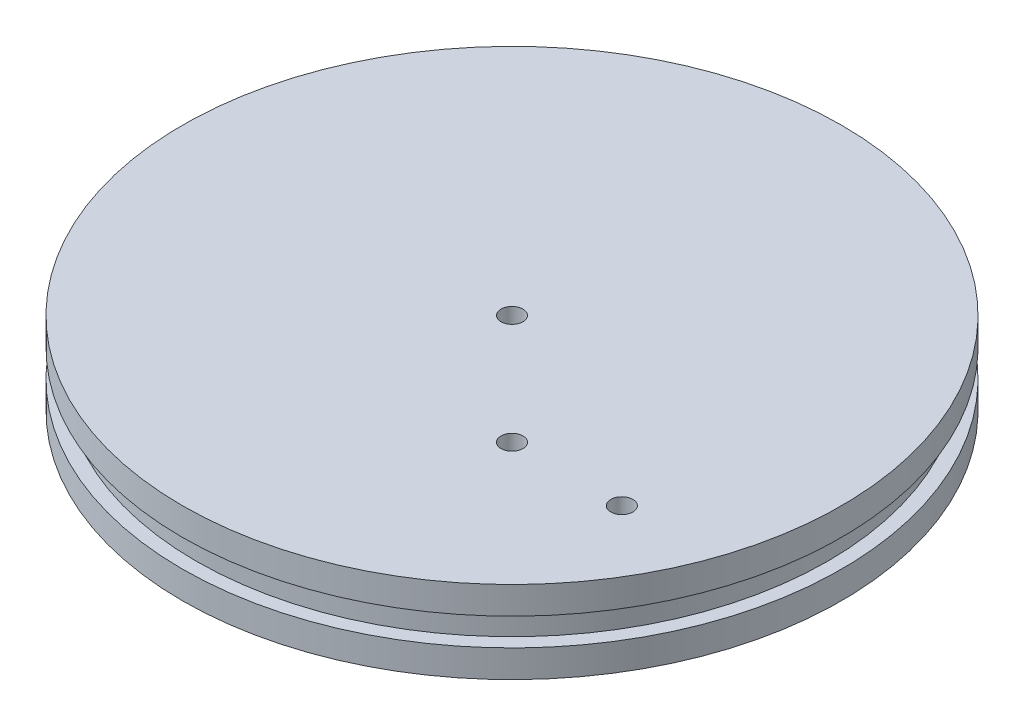
ISO-10303-21;
HEADER;
FILE_DESCRIPTION(('STEP AP214'),'2;1');
FILE_NAME('part.step','',(''),(''),'','','');
FILE_SCHEMA(('AUTOMOTIVE_DESIGN { 1 0 10303 214 1 1 1 1 }'));
ENDSEC;
DATA;
#1=APPLICATION_CONTEXT('core data for automotive mechanical design processes');
#2=APPLICATION_PROTOCOL_DEFINITION('international standard','automotive_design',2000,#1);
#3=PRODUCT_CONTEXT('',#1,'mechanical');
#4=PRODUCT('Part','Part','',(#3));
#5=PRODUCT_RELATED_PRODUCT_CATEGORY('part','',(#4));
#6=PRODUCT_DEFINITION_FORMATION('','',#4);
#7=PRODUCT_DEFINITION_CONTEXT('part definition',#1,'design');
#8=PRODUCT_DEFINITION('design','',#6,#7);
#9=PRODUCT_DEFINITION_SHAPE('','',#8);
#10=(LENGTH_UNIT() NAMED_UNIT(*) SI_UNIT(.MILLI.,.METRE.));
#11=(NAMED_UNIT(*) PLANE_ANGLE_UNIT() SI_UNIT($,.RADIAN.));
#12=(NAMED_UNIT(*) SI_UNIT($,.STERADIAN.) SOLID_ANGLE_UNIT());
#13=UNCERTAINTY_MEASURE_WITH_UNIT(LENGTH_MEASURE(1.E-05),#10,'distance_accuracy_value','');
#14=(GEOMETRIC_REPRESENTATION_CONTEXT(3) GLOBAL_UNCERTAINTY_ASSIGNED_CONTEXT((#13)) GLOBAL_UNIT_ASSIGNED_CONTEXT((#10,
#11,#12)) REPRESENTATION_CONTEXT('',''));
#15=CARTESIAN_POINT('',(0.,0.,0.));
#16=DIRECTION('',(0.,0.,1.));
#17=DIRECTION('',(1.,0.,0.));
#18=AXIS2_PLACEMENT_3D('',#15,#16,#17);
#19=CARTESIAN_POINT('',(0.,19.05,0.));
#20=DIRECTION('',(0.,-1.,0.));
#21=DIRECTION('',(0.,0.,-1.));
#22=AXIS2_PLACEMENT_3D('',#19,#20,#21);
#23=CYLINDRICAL_SURFACE('',#22,76.2);
#24=CARTESIAN_POINT('',(0.,0.,0.));
#25=DIRECTION('',(0.,1.,0.));
#26=DIRECTION('',(0.,0.,1.));
#27=AXIS2_PLACEMENT_3D('',#24,#25,#26);
#28=CIRCLE('',#27,76.2);
#29=CARTESIAN_POINT('',(0.,0.,-76.2));
#30=VERTEX_POINT('',#29);
#31=EDGE_CURVE('E35',#30,#30,#28,.T.);
#32=CARTESIAN_POINT('',(0.,6.35,0.));
#33=DIRECTION('',(0.,-1.,0.));
#34=DIRECTION('',(0.,0.,-1.));
#35=AXIS2_PLACEMENT_3D('',#32,#33,#34);
#36=CIRCLE('',#35,76.2);
#37=CARTESIAN_POINT('',(0.,6.35,-76.2));
#38=VERTEX_POINT('',#37);
#39=EDGE_CURVE('E59',#38,#38,#36,.T.);
#40=CARTESIAN_POINT('',(0.,0.,-76.2));
#41=CARTESIAN_POINT('',(0.,0.0661458333333329,-76.2));
#42=CARTESIAN_POINT('',(0.,0.132291666666666,-76.2));
#43=CARTESIAN_POINT('',(0.,0.264583333333333,-76.2));
#44=CARTESIAN_POINT('',(0.,0.330729166666667,-76.2));
#45=CARTESIAN_POINT('',(0.,0.463020833333334,-76.2));
#46=CARTESIAN_POINT('',(0.,0.529166666666667,-76.2));
#47=CARTESIAN_POINT('',(0.,0.661458333333333,-76.2));
#48=CARTESIAN_POINT('',(0.,0.727604166666666,-76.2));
#49=CARTESIAN_POINT('',(0.,0.859895833333334,-76.2));
#50=CARTESIAN_POINT('',(0.,0.926041666666668,-76.2));
#51=CARTESIAN_POINT('',(0.,1.05833333333333,-76.2));
#52=CARTESIAN_POINT('',(0.,1.12447916666667,-76.2));
#53=CARTESIAN_POINT('',(0.,1.25677083333333,-76.2));
#54=CARTESIAN_POINT('',(0.,1.32291666666667,-76.2));
#55=CARTESIAN_POINT('',(0.,1.45520833333333,-76.2));
#56=CARTESIAN_POINT('',(0.,1.52135416666667,-76.2));
#57=CARTESIAN_POINT('',(0.,1.65364583333333,-76.2));
#58=CARTESIAN_POINT('',(0.,1.71979166666667,-76.2));
#59=CARTESIAN_POINT('',(0.,1.85208333333333,-76.2));
#60=CARTESIAN_POINT('',(0.,1.91822916666667,-76.2));
#61=CARTESIAN_POINT('',(0.,2.05052083333333,-76.2));
#62=CARTESIAN_POINT('',(0.,2.11666666666667,-76.2));
#63=CARTESIAN_POINT('',(0.,2.24895833333333,-76.2));
#64=CARTESIAN_POINT('',(0.,2.31510416666667,-76.2));
#65=CARTESIAN_POINT('',(0.,2.44739583333333,-76.2));
#66=CARTESIAN_POINT('',(0.,2.51354166666667,-76.2));
#67=CARTESIAN_POINT('',(0.,2.64583333333333,-76.2));
#68=CARTESIAN_POINT('',(0.,2.71197916666667,-76.2));
#69=CARTESIAN_POINT('',(0.,2.84427083333333,-76.2));
#70=CARTESIAN_POINT('',(0.,2.91041666666667,-76.2));
#71=CARTESIAN_POINT('',(0.,3.04270833333333,-76.2));
#72=CARTESIAN_POINT('',(0.,3.10885416666667,-76.2));
#73=CARTESIAN_POINT('',(0.,3.24114583333333,-76.2));
#74=CARTESIAN_POINT('',(0.,3.30729166666667,-76.2));
#75=CARTESIAN_POINT('',(0.,3.43958333333333,-76.2));
#76=CARTESIAN_POINT('',(0.,3.50572916666667,-76.2));
#77=CARTESIAN_POINT('',(0.,3.63802083333333,-76.2));
#78=CARTESIAN_POINT('',(0.,3.70416666666667,-76.2));
#79=CARTESIAN_POINT('',(0.,3.83645833333333,-76.2));
#80=CARTESIAN_POINT('',(0.,3.90260416666667,-76.2));
#81=CARTESIAN_POINT('',(0.,4.03489583333333,-76.2));
#82=CARTESIAN_POINT('',(0.,4.10104166666667,-76.2));
#83=CARTESIAN_POINT('',(0.,4.23333333333333,-76.2));
#84=CARTESIAN_POINT('',(0.,4.29947916666667,-76.2));
#85=CARTESIAN_POINT('',(0.,4.43177083333333,-76.2));
#86=CARTESIAN_POINT('',(0.,4.49791666666667,-76.2));
#87=CARTESIAN_POINT('',(0.,4.63020833333333,-76.2));
#88=CARTESIAN_POINT('',(0.,4.69635416666667,-76.2));
#89=CARTESIAN_POINT('',(0.,4.82864583333333,-76.2));
#90=CARTESIAN_POINT('',(0.,4.89479166666667,-76.2));
#91=CARTESIAN_POINT('',(0.,5.02708333333333,-76.2));
#92=CARTESIAN_POINT('',(0.,5.09322916666667,-76.2));
#93=CARTESIAN_POINT('',(0.,5.22552083333333,-76.2));
#94=CARTESIAN_POINT('',(0.,5.29166666666667,-76.2));
#95=CARTESIAN_POINT('',(0.,5.42395833333333,-76.2));
#96=CARTESIAN_POINT('',(0.,5.49010416666667,-76.2));
#97=CARTESIAN_POINT('',(0.,5.62239583333333,-76.2));
#98=CARTESIAN_POINT('',(0.,5.68854166666667,-76.2));
#99=CARTESIAN_POINT('',(0.,5.82083333333333,-76.2));
#100=CARTESIAN_POINT('',(0.,5.88697916666667,-76.2));
#101=CARTESIAN_POINT('',(0.,6.01927083333333,-76.2));
#102=CARTESIAN_POINT('',(0.,6.08541666666667,-76.2));
#103=CARTESIAN_POINT('',(0.,6.21770833333333,-76.2));
#104=CARTESIAN_POINT('',(0.,6.28385416666667,-76.2));
#105=CARTESIAN_POINT('',(0.,6.35,-76.2));
#106=B_SPLINE_CURVE_WITH_KNOTS('',3,(#40,#41,#42,#43,#44,#45,#46,#47,#48,#49,#50,#51,#52,#53,
#54,#55,#56,#57,#58,#59,#60,#61,#62,#63,#64,#65,#66,#67,#68,#69,#70,#71,#72,#73,#74,#75,#76,#77,
#78,#79,#80,#81,#82,#83,#84,#85,#86,#87,#88,#89,#90,#91,#92,#93,#94,#95,#96,#97,#98,#99,#100,
#101,#102,#103,#104,#105),.UNSPECIFIED.,.F.,.F.,(4,2,2,2,2,2,2,2,2,2,2,2,2,2,2,2,2,2,2,2,2,2,2,
2,2,2,2,2,2,2,2,2,4),(0.,0.198437499999999,0.396875000000001,0.5953125,0.793749999999999,
0.992187500000002,1.190625,1.3890625,1.5875,1.7859375,1.984375,2.1828125,2.38125,2.5796875,
2.778125,2.9765625,3.175,3.3734375,3.571875,3.7703125,3.96875,4.1671875,4.365625,4.5640625,
4.7625,4.9609375,5.159375,5.3578125,5.55625,5.7546875,5.953125,6.1515625,6.35),.UNSPECIFIED.);
#107=EDGE_CURVE('BSEAM32',#30,#38,#106,.T.);
#108=ORIENTED_EDGE('',*,*,#31,.T.);
#109=ORIENTED_EDGE('',*,*,#39,.T.);
#110=ORIENTED_EDGE('',*,*,#107,.T.);
#111=ORIENTED_EDGE('',*,*,#107,.F.);
#112=EDGE_LOOP('',(#108,#110,#109,#111));
#113=FACE_BOUND('',#112,.T.);
#114=ADVANCED_FACE('F32',(#113),#23,.T.);
#115=CARTESIAN_POINT('',(0.,19.05,0.));
#116=DIRECTION('',(0.,1.,0.));
#117=DIRECTION('',(0.,0.,1.));
#118=AXIS2_PLACEMENT_3D('',#115,#116,#117);
#119=CIRCLE('',#118,76.2);
#120=CARTESIAN_POINT('',(0.,19.05,-76.2));
#121=VERTEX_POINT('',#120);
#122=EDGE_CURVE('E10',#121,#121,#119,.T.);
#123=CARTESIAN_POINT('',(0.,12.7,0.));
#124=DIRECTION('',(0.,-1.,0.));
#125=DIRECTION('',(0.,0.,-1.));
#126=AXIS2_PLACEMENT_3D('',#123,#124,#125);
#127=CIRCLE('',#126,76.2);
#128=CARTESIAN_POINT('',(0.,12.7,-76.2));
#129=VERTEX_POINT('',#128);
#130=EDGE_CURVE('E70',#129,#129,#127,.T.);
#131=CARTESIAN_POINT('',(0.,19.05,-76.2));
#132=CARTESIAN_POINT('',(0.,18.9838541666667,-76.2));
#133=CARTESIAN_POINT('',(0.,18.9177083333333,-76.2));
#134=CARTESIAN_POINT('',(0.,18.7854166666667,-76.2));
#135=CARTESIAN_POINT('',(0.,18.7192708333333,-76.2));
#136=CARTESIAN_POINT('',(0.,18.5869791666667,-76.2));
#137=CARTESIAN_POINT('',(0.,18.5208333333333,-76.2));
#138=CARTESIAN_POINT('',(0.,18.3885416666667,-76.2));
#139=CARTESIAN_POINT('',(0.,18.3223958333333,-76.2));
#140=CARTESIAN_POINT('',(0.,18.1901041666667,-76.2));
#141=CARTESIAN_POINT('',(0.,18.1239583333333,-76.2));
#142=CARTESIAN_POINT('',(0.,17.9916666666667,-76.2));
#143=CARTESIAN_POINT('',(0.,17.9255208333333,-76.2));
#144=CARTESIAN_POINT('',(0.,17.7932291666667,-76.2));
#145=CARTESIAN_POINT('',(0.,17.7270833333333,-76.2));
#146=CARTESIAN_POINT('',(0.,17.5947916666667,-76.2));
#147=CARTESIAN_POINT('',(0.,17.5286458333333,-76.2));
#148=CARTESIAN_POINT('',(0.,17.3963541666667,-76.2));
#149=CARTESIAN_POINT('',(0.,17.3302083333333,-76.2));
#150=CARTESIAN_POINT('',(0.,17.1979166666667,-76.2));
#151=CARTESIAN_POINT('',(0.,17.1317708333333,-76.2));
#152=CARTESIAN_POINT('',(0.,16.9994791666667,-76.2));
#153=CARTESIAN_POINT('',(0.,16.9333333333333,-76.2));
#154=CARTESIAN_POINT('',(0.,16.8010416666667,-76.2));
#155=CARTESIAN_POINT('',(0.,16.7348958333333,-76.2));
#156=CARTESIAN_POINT('',(0.,16.6026041666667,-76.2));
#157=CARTESIAN_POINT('',(0.,16.5364583333333,-76.2));
#158=CARTESIAN_POINT('',(0.,16.4041666666667,-76.2));
#159=CARTESIAN_POINT('',(0.,16.3380208333333,-76.2));
#160=CARTESIAN_POINT('',(0.,16.2057291666667,-76.2));
#161=CARTESIAN_POINT('',(0.,16.1395833333333,-76.2));
#162=CARTESIAN_POINT('',(0.,16.0072916666667,-76.2));
#163=CARTESIAN_POINT('',(0.,15.9411458333333,-76.2));
#164=CARTESIAN_POINT('',(0.,15.8088541666667,-76.2));
#165=CARTESIAN_POINT('',(0.,15.7427083333333,-76.2));
#166=CARTESIAN_POINT('',(0.,15.6104166666667,-76.2));
#167=CARTESIAN_POINT('',(0.,15.5442708333333,-76.2));
#168=CARTESIAN_POINT('',(0.,15.4119791666667,-76.2));
#169=CARTESIAN_POINT('',(0.,15.3458333333333,-76.2));
#170=CARTESIAN_POINT('',(0.,15.2135416666667,-76.2));
#171=CARTESIAN_POINT('',(0.,15.1473958333333,-76.2));
#172=CARTESIAN_POINT('',(0.,15.0151041666667,-76.2));
#173=CARTESIAN_POINT('',(0.,14.9489583333333,-76.2));
#174=CARTESIAN_POINT('',(0.,14.8166666666667,-76.2));
#175=CARTESIAN_POINT('',(0.,14.7505208333333,-76.2));
#176=CARTESIAN_POINT('',(0.,14.6182291666667,-76.2));
#177=CARTESIAN_POINT('',(0.,14.5520833333333,-76.2));
#178=CARTESIAN_POINT('',(0.,14.4197916666667,-76.2));
#179=CARTESIAN_POINT('',(0.,14.3536458333333,-76.2));
#180=CARTESIAN_POINT('',(0.,14.2213541666667,-76.2));
#181=CARTESIAN_POINT('',(0.,14.1552083333333,-76.2));
#182=CARTESIAN_POINT('',(0.,14.0229166666667,-76.2));
#183=CARTESIAN_POINT('',(0.,13.9567708333333,-76.2));
#184=CARTESIAN_POINT('',(0.,13.8244791666667,-76.2));
#185=CARTESIAN_POINT('',(0.,13.7583333333333,-76.2));
#186=CARTESIAN_POINT('',(0.,13.6260416666667,-76.2));
#187=CARTESIAN_POINT('',(0.,13.5598958333333,-76.2));
#188=CARTESIAN_POINT('',(0.,13.4276041666667,-76.2));
#189=CARTESIAN_POINT('',(0.,13.3614583333333,-76.2));
#190=CARTESIAN_POINT('',(0.,13.2291666666667,-76.2));
#191=CARTESIAN_POINT('',(0.,13.1630208333333,-76.2));
#192=CARTESIAN_POINT('',(0.,13.0307291666667,-76.2));
#193=CARTESIAN_POINT('',(0.,12.9645833333333,-76.2));
#194=CARTESIAN_POINT('',(0.,12.8322916666667,-76.2));
#195=CARTESIAN_POINT('',(0.,12.7661458333333,-76.2));
#196=CARTESIAN_POINT('',(0.,12.7,-76.2));
#197=B_SPLINE_CURVE_WITH_KNOTS('',3,(#131,#132,#133,#134,#135,#136,#137,#138,#139,#140,#141,
#142,#143,#144,#145,#146,#147,#148,#149,#150,#151,#152,#153,#154,#155,#156,#157,#158,#159,#160,
#161,#162,#163,#164,#165,#166,#167,#168,#169,#170,#171,#172,#173,#174,#175,#176,#177,#178,#179,
#180,#181,#182,#183,#184,#185,#186,#187,#188,#189,#190,#191,#192,#193,#194,#195,#196),
.UNSPECIFIED.,.F.,.F.,(4,2,2,2,2,2,2,2,2,2,2,2,2,2,2,2,2,2,2,2,2,2,2,2,2,2,2,2,2,2,2,2,4),(0.,
0.198437499999999,0.396874999999998,0.595312499999997,0.793749999999999,0.992187499999998,
1.190625,1.3890625,1.5875,1.7859375,1.984375,2.1828125,2.38125,2.5796875,2.778125,2.9765625,
3.175,3.3734375,3.571875,3.7703125,3.96875,4.1671875,4.365625,4.5640625,4.7625,4.96093749999999,
5.159375,5.3578125,5.55625,5.7546875,5.953125,6.1515625,6.34999999999999),.UNSPECIFIED.);
#198=EDGE_CURVE('BSEAM77',#121,#129,#197,.T.);
#199=ORIENTED_EDGE('',*,*,#122,.F.);
#200=ORIENTED_EDGE('',*,*,#130,.F.);
#201=ORIENTED_EDGE('',*,*,#198,.T.);
#202=ORIENTED_EDGE('',*,*,#198,.F.);
#203=EDGE_LOOP('',(#199,#201,#200,#202));
#204=FACE_BOUND('',#203,.T.);
#205=ADVANCED_FACE('F77',(#204),#23,.T.);
#206=CARTESIAN_POINT('',(0.,19.05,0.));
#207=DIRECTION('',(0.,1.,0.));
#208=DIRECTION('',(0.,0.,1.));
#209=AXIS2_PLACEMENT_3D('',#206,#207,#208);
#210=PLANE('',#209);
#211=CARTESIAN_POINT('',(25.4,19.05,25.4));
#212=DIRECTION('',(0.,1.,0.));
#213=DIRECTION('',(0.,0.,1.));
#214=AXIS2_PLACEMENT_3D('',#211,#212,#213);
#215=CIRCLE('',#214,2.54);
#216=CARTESIAN_POINT('',(25.4,19.05,22.86));
#217=VERTEX_POINT('',#216);
#218=EDGE_CURVE('E47',#217,#217,#215,.T.);
#219=ORIENTED_EDGE('',*,*,#218,.F.);
#220=EDGE_LOOP('',(#219));
#221=FACE_BOUND('',#220,.T.);
#222=ORIENTED_EDGE('',*,*,#122,.T.);
#223=EDGE_LOOP('',(#222));
#224=FACE_BOUND('',#223,.T.);
#225=CARTESIAN_POINT('',(0.,19.05,0.));
#226=DIRECTION('',(0.,1.,0.));
#227=DIRECTION('',(0.,0.,1.));
#228=AXIS2_PLACEMENT_3D('',#225,#226,#227);
#229=CIRCLE('',#228,2.54);
#230=CARTESIAN_POINT('',(0.,19.05,-2.54));
#231=VERTEX_POINT('',#230);
#232=EDGE_CURVE('E42',#231,#231,#229,.T.);
#233=ORIENTED_EDGE('',*,*,#232,.F.);
#234=EDGE_LOOP('',(#233));
#235=FACE_BOUND('',#234,.T.);
#236=CARTESIAN_POINT('',(50.8,19.05,25.4));
#237=DIRECTION('',(0.,1.,0.));
#238=DIRECTION('',(0.,0.,1.));
#239=AXIS2_PLACEMENT_3D('',#236,#237,#238);
#240=CIRCLE('',#239,2.54);
#241=CARTESIAN_POINT('',(50.8,19.05,22.86));
#242=VERTEX_POINT('',#241);
#243=EDGE_CURVE('E53',#242,#242,#240,.T.);
#244=ORIENTED_EDGE('',*,*,#243,.F.);
#245=EDGE_LOOP('',(#244));
#246=FACE_BOUND('',#245,.T.);
#247=ADVANCED_FACE('F79',(#221,#224,#235,#246),#210,.T.);
#248=CARTESIAN_POINT('',(0.,0.,0.));
#249=DIRECTION('',(0.,1.,0.));
#250=DIRECTION('',(0.,0.,1.));
#251=AXIS2_PLACEMENT_3D('',#248,#249,#250);
#252=PLANE('',#251);
#253=ORIENTED_EDGE('',*,*,#31,.F.);
#254=EDGE_LOOP('',(#253));
#255=FACE_BOUND('',#254,.T.);
#256=CARTESIAN_POINT('',(0.,0.,0.));
#257=DIRECTION('',(0.,1.,0.));
#258=DIRECTION('',(0.,0.,1.));
#259=AXIS2_PLACEMENT_3D('',#256,#257,#258);
#260=CIRCLE('',#259,2.54);
#261=CARTESIAN_POINT('',(0.,0.,-2.54));
#262=VERTEX_POINT('',#261);
#263=EDGE_CURVE('E44',#262,#262,#260,.T.);
#264=ORIENTED_EDGE('',*,*,#263,.T.);
#265=EDGE_LOOP('',(#264));
#266=FACE_BOUND('',#265,.T.);
#267=CARTESIAN_POINT('',(25.4,0.,25.4));
#268=DIRECTION('',(0.,1.,0.));
#269=DIRECTION('',(0.,0.,1.));
#270=AXIS2_PLACEMENT_3D('',#267,#268,#269);
#271=CIRCLE('',#270,2.54);
#272=CARTESIAN_POINT('',(25.4,0.,22.86));
#273=VERTEX_POINT('',#272);
#274=EDGE_CURVE('E50',#273,#273,#271,.T.);
#275=ORIENTED_EDGE('',*,*,#274,.T.);
#276=EDGE_LOOP('',(#275));
#277=FACE_BOUND('',#276,.T.);
#278=CARTESIAN_POINT('',(50.8,0.,25.4));
#279=DIRECTION('',(0.,1.,0.));
#280=DIRECTION('',(0.,0.,1.));
#281=AXIS2_PLACEMENT_3D('',#278,#279,#280);
#282=CIRCLE('',#281,2.54);
#283=CARTESIAN_POINT('',(50.8,0.,22.86));
#284=VERTEX_POINT('',#283);
#285=EDGE_CURVE('E56',#284,#284,#282,.T.);
#286=ORIENTED_EDGE('',*,*,#285,.T.);
#287=EDGE_LOOP('',(#286));
#288=FACE_BOUND('',#287,.T.);
#289=ADVANCED_FACE('F85',(#255,#266,#277,#288),#252,.F.);
#290=CARTESIAN_POINT('',(0.,19.05,0.));
#291=DIRECTION('',(0.,-1.,0.));
#292=DIRECTION('',(0.,0.,-1.));
#293=AXIS2_PLACEMENT_3D('',#290,#291,#292);
#294=CYLINDRICAL_SURFACE('',#293,2.54);
#295=CARTESIAN_POINT('',(0.,19.05,-2.54));
#296=CARTESIAN_POINT('',(0.,18.8515625,-2.54));
#297=CARTESIAN_POINT('',(0.,18.653125,-2.54));
#298=CARTESIAN_POINT('',(0.,18.25625,-2.54));
#299=CARTESIAN_POINT('',(0.,18.0578125,-2.54));
#300=CARTESIAN_POINT('',(0.,17.6609375,-2.54));
#301=CARTESIAN_POINT('',(0.,17.4625,-2.54));
#302=CARTESIAN_POINT('',(0.,17.065625,-2.54));
#303=CARTESIAN_POINT('',(0.,16.8671875,-2.54));
#304=CARTESIAN_POINT('',(0.,16.4703125,-2.54));
#305=CARTESIAN_POINT('',(0.,16.271875,-2.54));
#306=CARTESIAN_POINT('',(0.,15.875,-2.54));
#307=CARTESIAN_POINT('',(0.,15.6765625,-2.54));
#308=CARTESIAN_POINT('',(0.,15.2796875,-2.54));
#309=CARTESIAN_POINT('',(0.,15.08125,-2.54));
#310=CARTESIAN_POINT('',(0.,14.684375,-2.54));
#311=CARTESIAN_POINT('',(0.,14.4859375,-2.54));
#312=CARTESIAN_POINT('',(0.,14.0890625,-2.54));
#313=CARTESIAN_POINT('',(0.,13.890625,-2.54));
#314=CARTESIAN_POINT('',(0.,13.49375,-2.54));
#315=CARTESIAN_POINT('',(0.,13.2953125,-2.54));
#316=CARTESIAN_POINT('',(0.,12.8984375,-2.54));
#317=CARTESIAN_POINT('',(0.,12.7,-2.54));
#318=CARTESIAN_POINT('',(0.,12.303125,-2.54));
#319=CARTESIAN_POINT('',(0.,12.1046875,-2.54));
#320=CARTESIAN_POINT('',(0.,11.7078125,-2.54));
#321=CARTESIAN_POINT('',(0.,11.509375,-2.54));
#322=CARTESIAN_POINT('',(0.,11.1125,-2.54));
#323=CARTESIAN_POINT('',(0.,10.9140625,-2.54));
#324=CARTESIAN_POINT('',(0.,10.5171875,-2.54));
#325=CARTESIAN_POINT('',(0.,10.31875,-2.54));
#326=CARTESIAN_POINT('',(0.,9.921875,-2.54));
#327=CARTESIAN_POINT('',(0.,9.7234375,-2.54));
#328=CARTESIAN_POINT('',(0.,9.3265625,-2.54));
#329=CARTESIAN_POINT('',(0.,9.128125,-2.54));
#330=CARTESIAN_POINT('',(0.,8.73125,-2.54));
#331=CARTESIAN_POINT('',(0.,8.5328125,-2.54));
#332=CARTESIAN_POINT('',(0.,8.1359375,-2.54));
#333=CARTESIAN_POINT('',(0.,7.9375,-2.54));
#334=CARTESIAN_POINT('',(0.,7.540625,-2.54));
#335=CARTESIAN_POINT('',(0.,7.3421875,-2.54));
#336=CARTESIAN_POINT('',(0.,6.9453125,-2.54));
#337=CARTESIAN_POINT('',(0.,6.746875,-2.54));
#338=CARTESIAN_POINT('',(0.,6.35,-2.54));
#339=CARTESIAN_POINT('',(0.,6.1515625,-2.54));
#340=CARTESIAN_POINT('',(0.,5.7546875,-2.54));
#341=CARTESIAN_POINT('',(0.,5.55625,-2.54));
#342=CARTESIAN_POINT('',(0.,5.159375,-2.54));
#343=CARTESIAN_POINT('',(0.,4.9609375,-2.54));
#344=CARTESIAN_POINT('',(0.,4.5640625,-2.54));
#345=CARTESIAN_POINT('',(0.,4.365625,-2.54));
#346=CARTESIAN_POINT('',(0.,3.96875,-2.54));
#347=CARTESIAN_POINT('',(0.,3.7703125,-2.54));
#348=CARTESIAN_POINT('',(0.,3.3734375,-2.54));
#349=CARTESIAN_POINT('',(0.,3.175,-2.54));
#350=CARTESIAN_POINT('',(0.,2.778125,-2.54));
#351=CARTESIAN_POINT('',(0.,2.5796875,-2.54));
#352=CARTESIAN_POINT('',(0.,2.1828125,-2.54));
#353=CARTESIAN_POINT('',(0.,1.984375,-2.54));
#354=CARTESIAN_POINT('',(0.,1.5875,-2.54));
#355=CARTESIAN_POINT('',(0.,1.3890625,-2.54));
#356=CARTESIAN_POINT('',(0.,0.992187500000001,-2.54));
#357=CARTESIAN_POINT('',(0.,0.793750000000001,-2.54));
#358=CARTESIAN_POINT('',(0.,0.396875,-2.54));
#359=CARTESIAN_POINT('',(0.,0.1984375,-2.54));
#360=CARTESIAN_POINT('',(0.,0.,-2.54));
#361=B_SPLINE_CURVE_WITH_KNOTS('',3,(#295,#296,#297,#298,#299,#300,#301,#302,#303,#304,#305,
#306,#307,#308,#309,#310,#311,#312,#313,#314,#315,#316,#317,#318,#319,#320,#321,#322,#323,#324,
#325,#326,#327,#328,#329,#330,#331,#332,#333,#334,#335,#336,#337,#338,#339,#340,#341,#342,#343,
#344,#345,#346,#347,#348,#349,#350,#351,#352,#353,#354,#355,#356,#357,#358,#359,#360),
.UNSPECIFIED.,.F.,.F.,(4,2,2,2,2,2,2,2,2,2,2,2,2,2,2,2,2,2,2,2,2,2,2,2,2,2,2,2,2,2,2,2,4),(0.,
0.595312499999997,1.190625,1.7859375,2.38125,2.9765625,3.571875,4.1671875,4.7625,5.3578125,
5.953125,6.5484375,7.14375,7.7390625,8.334375,8.9296875,9.525,10.1203125,10.715625,11.3109375,
11.90625,12.5015625,13.096875,13.6921875,14.2875,14.8828125,15.478125,16.0734375,16.66875,
17.2640625,17.859375,18.4546875,19.05),.UNSPECIFIED.);
#362=EDGE_CURVE('BSEAM114',#231,#262,#361,.T.);
#363=ORIENTED_EDGE('',*,*,#232,.T.);
#364=ORIENTED_EDGE('',*,*,#263,.F.);
#365=ORIENTED_EDGE('',*,*,#362,.T.);
#366=ORIENTED_EDGE('',*,*,#362,.F.);
#367=EDGE_LOOP('',(#363,#365,#364,#366));
#368=FACE_BOUND('',#367,.T.);
#369=ADVANCED_FACE('F114',(#368),#294,.F.);
#370=CARTESIAN_POINT('',(25.4,19.05,25.4));
#371=DIRECTION('',(0.,-1.,0.));
#372=DIRECTION('',(0.,0.,-1.));
#373=AXIS2_PLACEMENT_3D('',#370,#371,#372);
#374=CYLINDRICAL_SURFACE('',#373,2.54);
#375=CARTESIAN_POINT('',(25.4,19.05,22.86));
#376=CARTESIAN_POINT('',(25.4,18.8515625,22.86));
#377=CARTESIAN_POINT('',(25.4,18.653125,22.86));
#378=CARTESIAN_POINT('',(25.4,18.25625,22.86));
#379=CARTESIAN_POINT('',(25.4,18.0578125,22.86));
#380=CARTESIAN_POINT('',(25.4,17.6609375,22.86));
#381=CARTESIAN_POINT('',(25.4,17.4625,22.86));
#382=CARTESIAN_POINT('',(25.4,17.065625,22.86));
#383=CARTESIAN_POINT('',(25.4,16.8671875,22.86));
#384=CARTESIAN_POINT('',(25.4,16.4703125,22.86));
#385=CARTESIAN_POINT('',(25.4,16.271875,22.86));
#386=CARTESIAN_POINT('',(25.4,15.875,22.86));
#387=CARTESIAN_POINT('',(25.4,15.6765625,22.86));
#388=CARTESIAN_POINT('',(25.4,15.2796875,22.86));
#389=CARTESIAN_POINT('',(25.4,15.08125,22.86));
#390=CARTESIAN_POINT('',(25.4,14.684375,22.86));
#391=CARTESIAN_POINT('',(25.4,14.4859375,22.86));
#392=CARTESIAN_POINT('',(25.4,14.0890625,22.86));
#393=CARTESIAN_POINT('',(25.4,13.890625,22.86));
#394=CARTESIAN_POINT('',(25.4,13.49375,22.86));
#395=CARTESIAN_POINT('',(25.4,13.2953125,22.86));
#396=CARTESIAN_POINT('',(25.4,12.8984375,22.86));
#397=CARTESIAN_POINT('',(25.4,12.7,22.86));
#398=CARTESIAN_POINT('',(25.4,12.303125,22.86));
#399=CARTESIAN_POINT('',(25.4,12.1046875,22.86));
#400=CARTESIAN_POINT('',(25.4,11.7078125,22.86));
#401=CARTESIAN_POINT('',(25.4,11.509375,22.86));
#402=CARTESIAN_POINT('',(25.4,11.1125,22.86));
#403=CARTESIAN_POINT('',(25.4,10.9140625,22.86));
#404=CARTESIAN_POINT('',(25.4,10.5171875,22.86));
#405=CARTESIAN_POINT('',(25.4,10.31875,22.86));
#406=CARTESIAN_POINT('',(25.4,9.921875,22.86));
#407=CARTESIAN_POINT('',(25.4,9.7234375,22.86));
#408=CARTESIAN_POINT('',(25.4,9.3265625,22.86));
#409=CARTESIAN_POINT('',(25.4,9.128125,22.86));
#410=CARTESIAN_POINT('',(25.4,8.73125,22.86));
#411=CARTESIAN_POINT('',(25.4,8.5328125,22.86));
#412=CARTESIAN_POINT('',(25.4,8.1359375,22.86));
#413=CARTESIAN_POINT('',(25.4,7.9375,22.86));
#414=CARTESIAN_POINT('',(25.4,7.540625,22.86));
#415=CARTESIAN_POINT('',(25.4,7.3421875,22.86));
#416=CARTESIAN_POINT('',(25.4,6.9453125,22.86));
#417=CARTESIAN_POINT('',(25.4,6.746875,22.86));
#418=CARTESIAN_POINT('',(25.4,6.35,22.86));
#419=CARTESIAN_POINT('',(25.4,6.1515625,22.86));
#420=CARTESIAN_POINT('',(25.4,5.7546875,22.86));
#421=CARTESIAN_POINT('',(25.4,5.55625,22.86));
#422=CARTESIAN_POINT('',(25.4,5.159375,22.86));
#423=CARTESIAN_POINT('',(25.4,4.9609375,22.86));
#424=CARTESIAN_POINT('',(25.4,4.5640625,22.86));
#425=CARTESIAN_POINT('',(25.4,4.365625,22.86));
#426=CARTESIAN_POINT('',(25.4,3.96875,22.86));
#427=CARTESIAN_POINT('',(25.4,3.7703125,22.86));
#428=CARTESIAN_POINT('',(25.4,3.3734375,22.86));
#429=CARTESIAN_POINT('',(25.4,3.175,22.86));
#430=CARTESIAN_POINT('',(25.4,2.778125,22.86));
#431=CARTESIAN_POINT('',(25.4,2.5796875,22.86));
#432=CARTESIAN_POINT('',(25.4,2.1828125,22.86));
#433=CARTESIAN_POINT('',(25.4,1.984375,22.86));
#434=CARTESIAN_POINT('',(25.4,1.5875,22.86));
#435=CARTESIAN_POINT('',(25.4,1.3890625,22.86));
#436=CARTESIAN_POINT('',(25.4,0.992187500000001,22.86));
#437=CARTESIAN_POINT('',(25.4,0.793750000000001,22.86));
#438=CARTESIAN_POINT('',(25.4,0.396875,22.86));
#439=CARTESIAN_POINT('',(25.4,0.1984375,22.86));
#440=CARTESIAN_POINT('',(25.4,0.,22.86));
#441=B_SPLINE_CURVE_WITH_KNOTS('',3,(#375,#376,#377,#378,#379,#380,#381,#382,#383,#384,#385,
#386,#387,#388,#389,#390,#391,#392,#393,#394,#395,#396,#397,#398,#399,#400,#401,#402,#403,#404,
#405,#406,#407,#408,#409,#410,#411,#412,#413,#414,#415,#416,#417,#418,#419,#420,#421,#422,#423,
#424,#425,#426,#427,#428,#429,#430,#431,#432,#433,#434,#435,#436,#437,#438,#439,#440),
.UNSPECIFIED.,.F.,.F.,(4,2,2,2,2,2,2,2,2,2,2,2,2,2,2,2,2,2,2,2,2,2,2,2,2,2,2,2,2,2,2,2,4),(0.,
0.595312499999997,1.190625,1.7859375,2.38125,2.9765625,3.571875,4.1671875,4.7625,5.3578125,
5.953125,6.5484375,7.14375,7.7390625,8.334375,8.9296875,9.525,10.1203125,10.715625,11.3109375,
11.90625,12.5015625,13.096875,13.6921875,14.2875,14.8828125,15.478125,16.0734375,16.66875,
17.2640625,17.859375,18.4546875,19.05),.UNSPECIFIED.);
#442=EDGE_CURVE('BSEAM107',#217,#273,#441,.T.);
#443=ORIENTED_EDGE('',*,*,#218,.T.);
#444=ORIENTED_EDGE('',*,*,#274,.F.);
#445=ORIENTED_EDGE('',*,*,#442,.T.);
#446=ORIENTED_EDGE('',*,*,#442,.F.);
#447=EDGE_LOOP('',(#443,#445,#444,#446));
#448=FACE_BOUND('',#447,.T.);
#449=ADVANCED_FACE('F107',(#448),#374,.F.);
#450=CARTESIAN_POINT('',(50.8,19.05,25.4));
#451=DIRECTION('',(0.,-1.,0.));
#452=DIRECTION('',(0.,0.,-1.));
#453=AXIS2_PLACEMENT_3D('',#450,#451,#452);
#454=CYLINDRICAL_SURFACE('',#453,2.54);
#455=CARTESIAN_POINT('',(50.8,19.05,22.86));
#456=CARTESIAN_POINT('',(50.8,18.8515625,22.86));
#457=CARTESIAN_POINT('',(50.8,18.653125,22.86));
#458=CARTESIAN_POINT('',(50.8,18.25625,22.86));
#459=CARTESIAN_POINT('',(50.8,18.0578125,22.86));
#460=CARTESIAN_POINT('',(50.8,17.6609375,22.86));
#461=CARTESIAN_POINT('',(50.8,17.4625,22.86));
#462=CARTESIAN_POINT('',(50.8,17.065625,22.86));
#463=CARTESIAN_POINT('',(50.8,16.8671875,22.86));
#464=CARTESIAN_POINT('',(50.8,16.4703125,22.86));
#465=CARTESIAN_POINT('',(50.8,16.271875,22.86));
#466=CARTESIAN_POINT('',(50.8,15.875,22.86));
#467=CARTESIAN_POINT('',(50.8,15.6765625,22.86));
#468=CARTESIAN_POINT('',(50.8,15.2796875,22.86));
#469=CARTESIAN_POINT('',(50.8,15.08125,22.86));
#470=CARTESIAN_POINT('',(50.8,14.684375,22.86));
#471=CARTESIAN_POINT('',(50.8,14.4859375,22.86));
#472=CARTESIAN_POINT('',(50.8,14.0890625,22.86));
#473=CARTESIAN_POINT('',(50.8,13.890625,22.86));
#474=CARTESIAN_POINT('',(50.8,13.49375,22.86));
#475=CARTESIAN_POINT('',(50.8,13.2953125,22.86));
#476=CARTESIAN_POINT('',(50.8,12.8984375,22.86));
#477=CARTESIAN_POINT('',(50.8,12.7,22.86));
#478=CARTESIAN_POINT('',(50.8,12.303125,22.86));
#479=CARTESIAN_POINT('',(50.8,12.1046875,22.86));
#480=CARTESIAN_POINT('',(50.8,11.7078125,22.86));
#481=CARTESIAN_POINT('',(50.8,11.509375,22.86));
#482=CARTESIAN_POINT('',(50.8,11.1125,22.86));
#483=CARTESIAN_POINT('',(50.8,10.9140625,22.86));
#484=CARTESIAN_POINT('',(50.8,10.5171875,22.86));
#485=CARTESIAN_POINT('',(50.8,10.31875,22.86));
#486=CARTESIAN_POINT('',(50.8,9.921875,22.86));
#487=CARTESIAN_POINT('',(50.8,9.7234375,22.86));
#488=CARTESIAN_POINT('',(50.8,9.3265625,22.86));
#489=CARTESIAN_POINT('',(50.8,9.128125,22.86));
#490=CARTESIAN_POINT('',(50.8,8.73125,22.86));
#491=CARTESIAN_POINT('',(50.8,8.5328125,22.86));
#492=CARTESIAN_POINT('',(50.8,8.1359375,22.86));
#493=CARTESIAN_POINT('',(50.8,7.9375,22.86));
#494=CARTESIAN_POINT('',(50.8,7.540625,22.86));
#495=CARTESIAN_POINT('',(50.8,7.3421875,22.86));
#496=CARTESIAN_POINT('',(50.8,6.9453125,22.86));
#497=CARTESIAN_POINT('',(50.8,6.746875,22.86));
#498=CARTESIAN_POINT('',(50.8,6.35,22.86));
#499=CARTESIAN_POINT('',(50.8,6.1515625,22.86));
#500=CARTESIAN_POINT('',(50.8,5.7546875,22.86));
#501=CARTESIAN_POINT('',(50.8,5.55625,22.86));
#502=CARTESIAN_POINT('',(50.8,5.159375,22.86));
#503=CARTESIAN_POINT('',(50.8,4.9609375,22.86));
#504=CARTESIAN_POINT('',(50.8,4.5640625,22.86));
#505=CARTESIAN_POINT('',(50.8,4.365625,22.86));
#506=CARTESIAN_POINT('',(50.8,3.96875,22.86));
#507=CARTESIAN_POINT('',(50.8,3.7703125,22.86));
#508=CARTESIAN_POINT('',(50.8,3.3734375,22.86));
#509=CARTESIAN_POINT('',(50.8,3.175,22.86));
#510=CARTESIAN_POINT('',(50.8,2.778125,22.86));
#511=CARTESIAN_POINT('',(50.8,2.5796875,22.86));
#512=CARTESIAN_POINT('',(50.8,2.1828125,22.86));
#513=CARTESIAN_POINT('',(50.8,1.984375,22.86));
#514=CARTESIAN_POINT('',(50.8,1.5875,22.86));
#515=CARTESIAN_POINT('',(50.8,1.3890625,22.86));
#516=CARTESIAN_POINT('',(50.8,0.992187500000001,22.86));
#517=CARTESIAN_POINT('',(50.8,0.793750000000001,22.86));
#518=CARTESIAN_POINT('',(50.8,0.396875,22.86));
#519=CARTESIAN_POINT('',(50.8,0.1984375,22.86));
#520=CARTESIAN_POINT('',(50.8,0.,22.86));
#521=B_SPLINE_CURVE_WITH_KNOTS('',3,(#455,#456,#457,#458,#459,#460,#461,#462,#463,#464,#465,
#466,#467,#468,#469,#470,#471,#472,#473,#474,#475,#476,#477,#478,#479,#480,#481,#482,#483,#484,
#485,#486,#487,#488,#489,#490,#491,#492,#493,#494,#495,#496,#497,#498,#499,#500,#501,#502,#503,
#504,#505,#506,#507,#508,#509,#510,#511,#512,#513,#514,#515,#516,#517,#518,#519,#520),
.UNSPECIFIED.,.F.,.F.,(4,2,2,2,2,2,2,2,2,2,2,2,2,2,2,2,2,2,2,2,2,2,2,2,2,2,2,2,2,2,2,2,4),(0.,
0.595312499999997,1.190625,1.7859375,2.38125,2.9765625,3.571875,4.1671875,4.7625,5.3578125,
5.953125,6.5484375,7.14375,7.7390625,8.334375,8.9296875,9.525,10.1203125,10.715625,11.3109375,
11.90625,12.5015625,13.096875,13.6921875,14.2875,14.8828125,15.478125,16.0734375,16.66875,
17.2640625,17.859375,18.4546875,19.05),.UNSPECIFIED.);
#522=EDGE_CURVE('BSEAM98',#242,#284,#521,.T.);
#523=ORIENTED_EDGE('',*,*,#243,.T.);
#524=ORIENTED_EDGE('',*,*,#285,.F.);
#525=ORIENTED_EDGE('',*,*,#522,.T.);
#526=ORIENTED_EDGE('',*,*,#522,.F.);
#527=EDGE_LOOP('',(#523,#525,#524,#526));
#528=FACE_BOUND('',#527,.T.);
#529=ADVANCED_FACE('F98',(#528),#454,.F.);
#530=CARTESIAN_POINT('',(-76.2,6.35,0.));
#531=DIRECTION('',(0.,1.,0.));
#532=DIRECTION('',(0.,0.,1.));
#533=AXIS2_PLACEMENT_3D('',#530,#531,#532);
#534=PLANE('',#533);
#535=CARTESIAN_POINT('',(0.,6.35,0.));
#536=DIRECTION('',(0.,-1.,0.));
#537=DIRECTION('',(0.,0.,-1.));
#538=AXIS2_PLACEMENT_3D('',#535,#536,#537);
#539=CIRCLE('',#538,73.025);
#540=CARTESIAN_POINT('',(0.,6.35,-73.025));
#541=VERTEX_POINT('',#540);
#542=EDGE_CURVE('E64',#541,#541,#539,.T.);
#543=ORIENTED_EDGE('',*,*,#542,.T.);
#544=EDGE_LOOP('',(#543));
#545=FACE_BOUND('',#544,.T.);
#546=ORIENTED_EDGE('',*,*,#39,.F.);
#547=EDGE_LOOP('',(#546));
#548=FACE_BOUND('',#547,.T.);
#549=ADVANCED_FACE('F95',(#545,#548),#534,.T.);
#550=CARTESIAN_POINT('',(0.,4.7625,0.));
#551=DIRECTION('',(0.,-1.,0.));
#552=DIRECTION('',(0.,0.,-1.));
#553=AXIS2_PLACEMENT_3D('',#550,#551,#552);
#554=CYLINDRICAL_SURFACE('',#553,73.025);
#555=CARTESIAN_POINT('',(0.,12.7,0.));
#556=DIRECTION('',(0.,-1.,0.));
#557=DIRECTION('',(0.,0.,-1.));
#558=AXIS2_PLACEMENT_3D('',#555,#556,#557);
#559=CIRCLE('',#558,73.025);
#560=CARTESIAN_POINT('',(0.,12.7,-73.025));
#561=VERTEX_POINT('',#560);
#562=EDGE_CURVE('E67',#561,#561,#559,.T.);
#563=ORIENTED_EDGE('',*,*,#562,.T.);
#564=EDGE_LOOP('',(#563));
#565=FACE_BOUND('',#564,.T.);
#566=ORIENTED_EDGE('',*,*,#542,.F.);
#567=EDGE_LOOP('',(#566));
#568=FACE_BOUND('',#567,.T.);
#569=ADVANCED_FACE('F97',(#565,#568),#554,.T.);
#570=CARTESIAN_POINT('',(-76.2,12.7,0.));
#571=DIRECTION('',(0.,-1.,0.));
#572=DIRECTION('',(0.,0.,-1.));
#573=AXIS2_PLACEMENT_3D('',#570,#571,#572);
#574=PLANE('',#573);
#575=ORIENTED_EDGE('',*,*,#130,.T.);
#576=EDGE_LOOP('',(#575));
#577=FACE_BOUND('',#576,.T.);
#578=ORIENTED_EDGE('',*,*,#562,.F.);
#579=EDGE_LOOP('',(#578));
#580=FACE_BOUND('',#579,.T.);
#581=ADVANCED_FACE('F74',(#577,#580),#574,.T.);
#582=CLOSED_SHELL('',(#114,#205,#247,#289,#369,#449,#529,#549,#569,#581));
#583=MANIFOLD_SOLID_BREP('B2',#582);
#584=ADVANCED_BREP_SHAPE_REPRESENTATION('',(#18,#583),#14);
#585=SHAPE_DEFINITION_REPRESENTATION(#9,#584);
ENDSEC;
END-ISO-10303-21;
